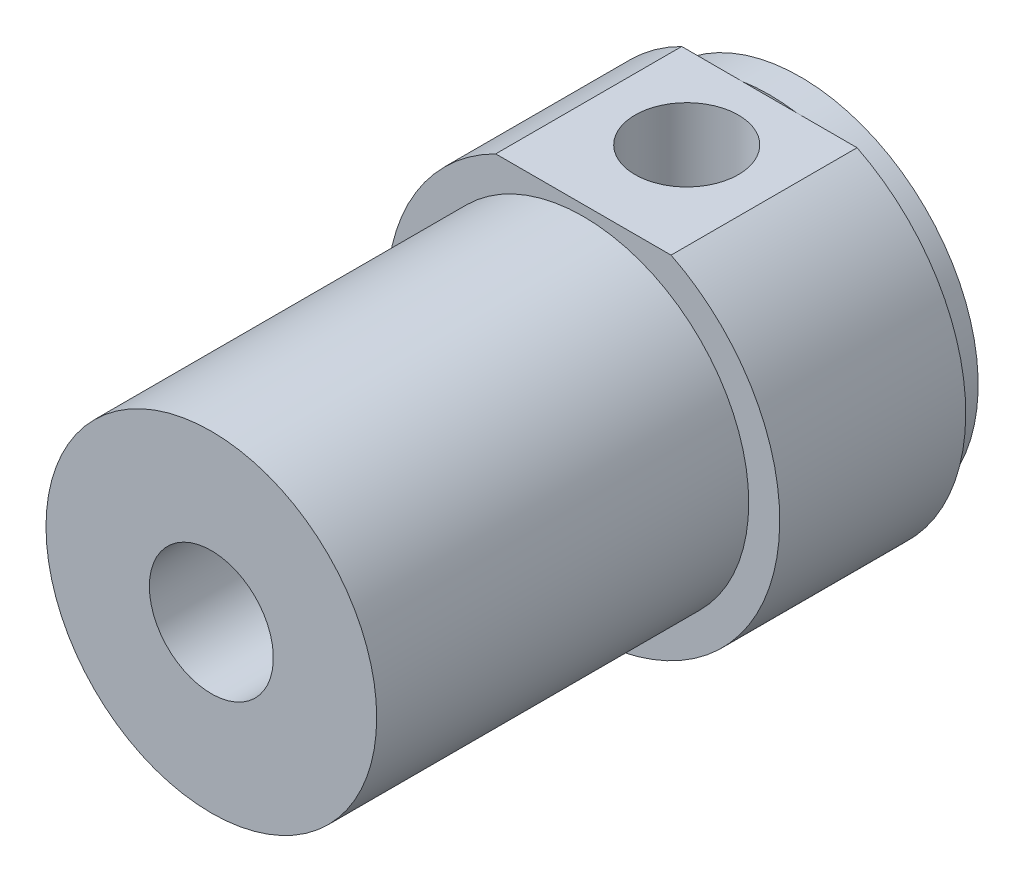
ISO-10303-21;
HEADER;
FILE_DESCRIPTION(('STEP AP214'),'2;1');
FILE_NAME('part.step','',(''),(''),'','','');
FILE_SCHEMA(('AUTOMOTIVE_DESIGN { 1 0 10303 214 1 1 1 1 }'));
ENDSEC;
DATA;
#1=APPLICATION_CONTEXT('core data for automotive mechanical design processes');
#2=APPLICATION_PROTOCOL_DEFINITION('international standard','automotive_design',2000,#1);
#3=PRODUCT_CONTEXT('',#1,'mechanical');
#4=PRODUCT('Part','Part','',(#3));
#5=PRODUCT_RELATED_PRODUCT_CATEGORY('part','',(#4));
#6=PRODUCT_DEFINITION_FORMATION('','',#4);
#7=PRODUCT_DEFINITION_CONTEXT('part definition',#1,'design');
#8=PRODUCT_DEFINITION('design','',#6,#7);
#9=PRODUCT_DEFINITION_SHAPE('','',#8);
#10=(LENGTH_UNIT() NAMED_UNIT(*) SI_UNIT(.MILLI.,.METRE.));
#11=(NAMED_UNIT(*) PLANE_ANGLE_UNIT() SI_UNIT($,.RADIAN.));
#12=(NAMED_UNIT(*) SI_UNIT($,.STERADIAN.) SOLID_ANGLE_UNIT());
#13=UNCERTAINTY_MEASURE_WITH_UNIT(LENGTH_MEASURE(1.E-05),#10,'distance_accuracy_value','');
#14=(GEOMETRIC_REPRESENTATION_CONTEXT(3) GLOBAL_UNCERTAINTY_ASSIGNED_CONTEXT((#13)) GLOBAL_UNIT_ASSIGNED_CONTEXT((#10,
#11,#12)) REPRESENTATION_CONTEXT('',''));
#15=CARTESIAN_POINT('',(0.,0.,0.));
#16=DIRECTION('',(0.,0.,1.));
#17=DIRECTION('',(1.,0.,0.));
#18=AXIS2_PLACEMENT_3D('',#15,#16,#17);
#19=CARTESIAN_POINT('',(0.,0.,27.));
#20=DIRECTION('',(0.,0.,-1.));
#21=DIRECTION('',(-1.,0.,0.));
#22=AXIS2_PLACEMENT_3D('',#19,#20,#21);
#23=CYLINDRICAL_SURFACE('',#22,3.);
#24=CARTESIAN_POINT('',(0.,0.,27.));
#25=DIRECTION('',(0.,0.,-1.));
#26=DIRECTION('',(-1.,0.,0.));
#27=AXIS2_PLACEMENT_3D('',#24,#25,#26);
#28=CIRCLE('',#27,3.);
#29=CARTESIAN_POINT('',(-3.,0.,27.));
#30=VERTEX_POINT('',#29);
#31=EDGE_CURVE('E38',#30,#30,#28,.F.);
#32=ORIENTED_EDGE('',*,*,#31,.T.);
#33=EDGE_LOOP('',(#32));
#34=FACE_BOUND('',#33,.T.);
#35=CARTESIAN_POINT('',(0.,0.,-1.5));
#36=DIRECTION('',(0.,0.,1.));
#37=DIRECTION('',(1.,0.,0.));
#38=AXIS2_PLACEMENT_3D('',#35,#36,#37);
#39=CIRCLE('',#38,3.);
#40=CARTESIAN_POINT('',(3.,0.,-1.5));
#41=VERTEX_POINT('',#40);
#42=EDGE_CURVE('E109',#41,#41,#39,.T.);
#43=ORIENTED_EDGE('',*,*,#42,.F.);
#44=EDGE_LOOP('',(#43));
#45=FACE_BOUND('',#44,.T.);
#46=ADVANCED_FACE('F34',(#34,#45),#23,.F.);
#47=CARTESIAN_POINT('',(0.,0.,27.));
#48=DIRECTION('',(0.,0.,-1.));
#49=DIRECTION('',(-1.,0.,0.));
#50=AXIS2_PLACEMENT_3D('',#47,#48,#49);
#51=PLANE('',#50);
#52=ORIENTED_EDGE('',*,*,#31,.F.);
#53=EDGE_LOOP('',(#52));
#54=FACE_BOUND('',#53,.T.);
#55=CARTESIAN_POINT('',(0.,0.,27.));
#56=DIRECTION('',(0.,0.,1.));
#57=DIRECTION('',(1.,0.,0.));
#58=AXIS2_PLACEMENT_3D('',#55,#56,#57);
#59=CIRCLE('',#58,8.);
#60=CARTESIAN_POINT('',(8.,0.,27.));
#61=VERTEX_POINT('',#60);
#62=EDGE_CURVE('E104',#61,#61,#59,.F.);
#63=ORIENTED_EDGE('',*,*,#62,.F.);
#64=EDGE_LOOP('',(#63));
#65=FACE_BOUND('',#64,.T.);
#66=ADVANCED_FACE('F137',(#54,#65),#51,.F.);
#67=CARTESIAN_POINT('',(-2.54999999999999,4.5,1.45));
#68=DIRECTION('',(0.,-1.,0.));
#69=DIRECTION('',(1.,0.,0.));
#70=AXIS2_PLACEMENT_3D('',#67,#68,#69);
#71=PLANE('',#70);
#72=CARTESIAN_POINT('',(0.,4.49999999999999,4.));
#73=DIRECTION('',(0.,-1.,0.));
#74=DIRECTION('',(1.,0.,0.));
#75=AXIS2_PLACEMENT_3D('',#72,#73,#74);
#76=CIRCLE('',#75,2.5);
#77=CARTESIAN_POINT('',(2.50000000000001,4.5,4.));
#78=VERTEX_POINT('',#77);
#79=EDGE_CURVE('E102',#78,#78,#76,.F.);
#80=ORIENTED_EDGE('',*,*,#79,.T.);
#81=EDGE_LOOP('',(#80));
#82=FACE_BOUND('',#81,.T.);
#83=ADVANCED_FACE('F134',(#82),#71,.F.);
#84=CARTESIAN_POINT('',(0.,0.,-1.5));
#85=DIRECTION('',(0.,0.,1.));
#86=DIRECTION('',(1.,0.,0.));
#87=AXIS2_PLACEMENT_3D('',#84,#85,#86);
#88=PLANE('',#87);
#89=ORIENTED_EDGE('',*,*,#42,.T.);
#90=EDGE_LOOP('',(#89));
#91=FACE_BOUND('',#90,.T.);
#92=CARTESIAN_POINT('',(0.,0.,-1.5));
#93=DIRECTION('',(0.,0.,-1.));
#94=DIRECTION('',(-1.,0.,0.));
#95=AXIS2_PLACEMENT_3D('',#92,#93,#94);
#96=CIRCLE('',#95,8.6);
#97=CARTESIAN_POINT('',(-8.6,0.,-1.5));
#98=VERTEX_POINT('',#97);
#99=EDGE_CURVE('E81',#98,#98,#96,.F.);
#100=ORIENTED_EDGE('',*,*,#99,.F.);
#101=EDGE_LOOP('',(#100));
#102=FACE_BOUND('',#101,.T.);
#103=ADVANCED_FACE('F136',(#91,#102),#88,.F.);
#104=CARTESIAN_POINT('',(0.,0.,9.));
#105=DIRECTION('',(0.,0.,1.));
#106=DIRECTION('',(1.,0.,0.));
#107=AXIS2_PLACEMENT_3D('',#104,#105,#106);
#108=CYLINDRICAL_SURFACE('',#107,8.);
#109=CARTESIAN_POINT('',(0.,0.,9.));
#110=DIRECTION('',(0.,0.,1.));
#111=DIRECTION('',(1.,0.,0.));
#112=AXIS2_PLACEMENT_3D('',#109,#110,#111);
#113=CIRCLE('',#112,8.);
#114=CARTESIAN_POINT('',(8.,0.,9.));
#115=VERTEX_POINT('',#114);
#116=EDGE_CURVE('E74',#115,#115,#113,.T.);
#117=ORIENTED_EDGE('',*,*,#116,.T.);
#118=EDGE_LOOP('',(#117));
#119=FACE_BOUND('',#118,.T.);
#120=ORIENTED_EDGE('',*,*,#62,.T.);
#121=EDGE_LOOP('',(#120));
#122=FACE_BOUND('',#121,.T.);
#123=ADVANCED_FACE('F143',(#119,#122),#108,.T.);
#124=CARTESIAN_POINT('',(0.,0.,0.));
#125=DIRECTION('',(0.,0.,1.));
#126=DIRECTION('',(1.,0.,0.));
#127=AXIS2_PLACEMENT_3D('',#124,#125,#126);
#128=PLANE('',#127);
#129=DIRECTION('',(1.,0.,0.));
#130=VECTOR('',#129,1.);
#131=CARTESIAN_POINT('',(4.2426406871193,8.5,0.));
#132=LINE('',#131,#130);
#133=CARTESIAN_POINT('',(-1.30766968306221,8.5,0.));
#134=VERTEX_POINT('',#133);
#135=CARTESIAN_POINT('',(1.30766968306222,8.5,0.));
#136=VERTEX_POINT('',#135);
#137=EDGE_CURVE('E70',#134,#136,#132,.T.);
#138=ORIENTED_EDGE('',*,*,#137,.T.);
#139=CARTESIAN_POINT('',(0.,0.,0.));
#140=DIRECTION('',(0.,0.,-1.));
#141=DIRECTION('',(-1.,0.,0.));
#142=AXIS2_PLACEMENT_3D('',#139,#140,#141);
#143=CIRCLE('',#142,8.6);
#144=EDGE_CURVE('E68',#134,#136,#143,.T.);
#145=ORIENTED_EDGE('',*,*,#144,.F.);
#146=EDGE_LOOP('',(#138,#145));
#147=FACE_BOUND('',#146,.T.);
#148=ADVANCED_FACE('F71',(#147),#128,.T.);
#149=CARTESIAN_POINT('',(0.,8.5,4.));
#150=DIRECTION('',(0.,-1.,0.));
#151=DIRECTION('',(1.,0.,0.));
#152=AXIS2_PLACEMENT_3D('',#149,#150,#151);
#153=CYLINDRICAL_SURFACE('',#152,2.5);
#154=ORIENTED_EDGE('',*,*,#79,.F.);
#155=EDGE_LOOP('',(#154));
#156=FACE_BOUND('',#155,.T.);
#157=CARTESIAN_POINT('',(0.,8.49999999999999,4.));
#158=DIRECTION('',(0.,-1.,0.));
#159=DIRECTION('',(1.,0.,0.));
#160=AXIS2_PLACEMENT_3D('',#157,#158,#159);
#161=CIRCLE('',#160,2.5);
#162=CARTESIAN_POINT('',(2.50000000000001,8.5,4.));
#163=VERTEX_POINT('',#162);
#164=EDGE_CURVE('E91',#163,#163,#161,.F.);
#165=ORIENTED_EDGE('',*,*,#164,.T.);
#166=EDGE_LOOP('',(#165));
#167=FACE_BOUND('',#166,.T.);
#168=ADVANCED_FACE('F36',(#156,#167),#153,.F.);
#169=CARTESIAN_POINT('',(0.,0.,0.));
#170=DIRECTION('',(0.,0.,-1.));
#171=DIRECTION('',(-1.,0.,0.));
#172=AXIS2_PLACEMENT_3D('',#169,#170,#171);
#173=CYLINDRICAL_SURFACE('',#172,8.6);
#174=CARTESIAN_POINT('',(0.,0.,0.));
#175=DIRECTION('',(0.,0.,-1.));
#176=DIRECTION('',(-1.,0.,0.));
#177=AXIS2_PLACEMENT_3D('',#174,#175,#176);
#178=CIRCLE('',#177,8.6);
#179=EDGE_CURVE('E80',#134,#136,#178,.F.);
#180=ORIENTED_EDGE('',*,*,#179,.F.);
#181=ORIENTED_EDGE('',*,*,#144,.T.);
#182=EDGE_LOOP('',(#180,#181));
#183=FACE_BOUND('',#182,.T.);
#184=ORIENTED_EDGE('',*,*,#99,.T.);
#185=EDGE_LOOP('',(#184));
#186=FACE_BOUND('',#185,.T.);
#187=ADVANCED_FACE('F77',(#183,#186),#173,.T.);
#188=CARTESIAN_POINT('',(0.,0.,9.));
#189=DIRECTION('',(0.,0.,-1.));
#190=DIRECTION('',(-1.,0.,0.));
#191=AXIS2_PLACEMENT_3D('',#188,#189,#190);
#192=PLANE('',#191);
#193=ORIENTED_EDGE('',*,*,#116,.F.);
#194=EDGE_LOOP('',(#193));
#195=FACE_BOUND('',#194,.T.);
#196=CARTESIAN_POINT('',(0.,0.,9.));
#197=DIRECTION('',(0.,0.,1.));
#198=DIRECTION('',(1.,0.,0.));
#199=AXIS2_PLACEMENT_3D('',#196,#197,#198);
#200=CIRCLE('',#199,9.5);
#201=CARTESIAN_POINT('',(4.24264068711929,8.5,9.));
#202=VERTEX_POINT('',#201);
#203=CARTESIAN_POINT('',(-4.24264068711928,8.5,9.));
#204=VERTEX_POINT('',#203);
#205=EDGE_CURVE('E96',#202,#204,#200,.F.);
#206=ORIENTED_EDGE('',*,*,#205,.F.);
#207=DIRECTION('',(1.,0.,0.));
#208=VECTOR('',#207,1.);
#209=CARTESIAN_POINT('',(4.2426406871193,8.5,9.));
#210=LINE('',#209,#208);
#211=EDGE_CURVE('E73',#202,#204,#210,.F.);
#212=ORIENTED_EDGE('',*,*,#211,.T.);
#213=EDGE_LOOP('',(#206,#212));
#214=FACE_BOUND('',#213,.T.);
#215=ADVANCED_FACE('F123',(#195,#214),#192,.F.);
#216=CARTESIAN_POINT('',(4.2426406871193,8.5,0.));
#217=DIRECTION('',(0.,-1.,0.));
#218=DIRECTION('',(0.,0.,-1.));
#219=AXIS2_PLACEMENT_3D('',#216,#217,#218);
#220=PLANE('',#219);
#221=ORIENTED_EDGE('',*,*,#164,.F.);
#222=EDGE_LOOP('',(#221));
#223=FACE_BOUND('',#222,.T.);
#224=DIRECTION('',(0.,0.,1.));
#225=VECTOR('',#224,1.);
#226=CARTESIAN_POINT('',(4.24264068711929,8.49999999999999,0.));
#227=LINE('',#226,#225);
#228=CARTESIAN_POINT('',(4.24264068711929,8.5,0.));
#229=VERTEX_POINT('',#228);
#230=EDGE_CURVE('E87',#229,#202,#227,.T.);
#231=ORIENTED_EDGE('',*,*,#230,.F.);
#232=DIRECTION('',(-1.,0.,0.));
#233=VECTOR('',#232,1.);
#234=CARTESIAN_POINT('',(0.,8.5,0.));
#235=LINE('',#234,#233);
#236=EDGE_CURVE('E84',#136,#229,#235,.F.);
#237=ORIENTED_EDGE('',*,*,#236,.F.);
#238=ORIENTED_EDGE('',*,*,#137,.F.);
#239=DIRECTION('',(-1.,0.,0.));
#240=VECTOR('',#239,1.);
#241=CARTESIAN_POINT('',(0.,8.5,0.));
#242=LINE('',#241,#240);
#243=CARTESIAN_POINT('',(-4.24264068711928,8.5,0.));
#244=VERTEX_POINT('',#243);
#245=EDGE_CURVE('E53',#244,#134,#242,.F.);
#246=ORIENTED_EDGE('',*,*,#245,.F.);
#247=DIRECTION('',(0.,0.,1.));
#248=VECTOR('',#247,1.);
#249=CARTESIAN_POINT('',(-4.24264068711928,8.5,0.));
#250=LINE('',#249,#248);
#251=EDGE_CURVE('E44',#204,#244,#250,.F.);
#252=ORIENTED_EDGE('',*,*,#251,.F.);
#253=ORIENTED_EDGE('',*,*,#211,.F.);
#254=EDGE_LOOP('',(#231,#237,#238,#246,#252,#253));
#255=FACE_BOUND('',#254,.T.);
#256=ADVANCED_FACE('F85',(#223,#255),#220,.F.);
#257=CARTESIAN_POINT('',(0.,0.,0.));
#258=DIRECTION('',(0.,0.,-1.));
#259=DIRECTION('',(-1.,0.,0.));
#260=AXIS2_PLACEMENT_3D('',#257,#258,#259);
#261=PLANE('',#260);
#262=CARTESIAN_POINT('',(0.,0.,0.));
#263=DIRECTION('',(0.,0.,1.));
#264=DIRECTION('',(1.,0.,0.));
#265=AXIS2_PLACEMENT_3D('',#262,#263,#264);
#266=CIRCLE('',#265,9.5);
#267=EDGE_CURVE('E11',#244,#229,#266,.T.);
#268=ORIENTED_EDGE('',*,*,#267,.F.);
#269=ORIENTED_EDGE('',*,*,#245,.T.);
#270=ORIENTED_EDGE('',*,*,#179,.T.);
#271=ORIENTED_EDGE('',*,*,#236,.T.);
#272=EDGE_LOOP('',(#268,#269,#270,#271));
#273=FACE_BOUND('',#272,.T.);
#274=ADVANCED_FACE('F90',(#273),#261,.T.);
#275=CARTESIAN_POINT('',(0.,0.,0.));
#276=DIRECTION('',(0.,0.,1.));
#277=DIRECTION('',(1.,0.,0.));
#278=AXIS2_PLACEMENT_3D('',#275,#276,#277);
#279=CYLINDRICAL_SURFACE('',#278,9.5);
#280=ORIENTED_EDGE('',*,*,#251,.T.);
#281=ORIENTED_EDGE('',*,*,#267,.T.);
#282=ORIENTED_EDGE('',*,*,#230,.T.);
#283=ORIENTED_EDGE('',*,*,#205,.T.);
#284=EDGE_LOOP('',(#280,#281,#282,#283));
#285=FACE_BOUND('',#284,.T.);
#286=ADVANCED_FACE('F126',(#285),#279,.T.);
#287=CLOSED_SHELL('',(#46,#66,#83,#103,#123,#148,#168,#187,#215,#256,#274,#286));
#288=MANIFOLD_SOLID_BREP('B2',#287);
#289=ADVANCED_BREP_SHAPE_REPRESENTATION('',(#18,#288),#14);
#290=SHAPE_DEFINITION_REPRESENTATION(#9,#289);
ENDSEC;
END-ISO-10303-21;
